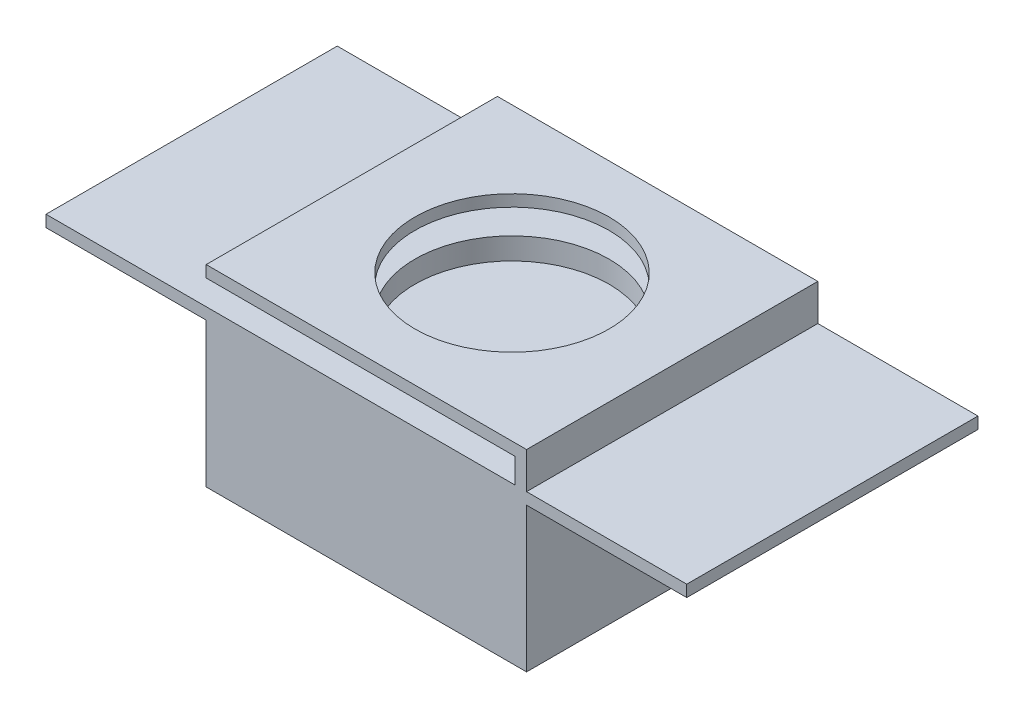
ISO-10303-21;
HEADER;
FILE_DESCRIPTION(('STEP AP214'),'2;1');
FILE_NAME('part.step','',(''),(''),'','','');
FILE_SCHEMA(('AUTOMOTIVE_DESIGN { 1 0 10303 214 1 1 1 1 }'));
ENDSEC;
DATA;
#1=APPLICATION_CONTEXT('core data for automotive mechanical design processes');
#2=APPLICATION_PROTOCOL_DEFINITION('international standard','automotive_design',2000,#1);
#3=PRODUCT_CONTEXT('',#1,'mechanical');
#4=PRODUCT('Part','Part','',(#3));
#5=PRODUCT_RELATED_PRODUCT_CATEGORY('part','',(#4));
#6=PRODUCT_DEFINITION_FORMATION('','',#4);
#7=PRODUCT_DEFINITION_CONTEXT('part definition',#1,'design');
#8=PRODUCT_DEFINITION('design','',#6,#7);
#9=PRODUCT_DEFINITION_SHAPE('','',#8);
#10=(LENGTH_UNIT() NAMED_UNIT(*) SI_UNIT(.MILLI.,.METRE.));
#11=(NAMED_UNIT(*) PLANE_ANGLE_UNIT() SI_UNIT($,.RADIAN.));
#12=(NAMED_UNIT(*) SI_UNIT($,.STERADIAN.) SOLID_ANGLE_UNIT());
#13=UNCERTAINTY_MEASURE_WITH_UNIT(LENGTH_MEASURE(1.E-05),#10,'distance_accuracy_value','');
#14=(GEOMETRIC_REPRESENTATION_CONTEXT(3) GLOBAL_UNCERTAINTY_ASSIGNED_CONTEXT((#13)) GLOBAL_UNIT_ASSIGNED_CONTEXT((#10,
#11,#12)) REPRESENTATION_CONTEXT('',''));
#15=CARTESIAN_POINT('',(0.,0.,0.));
#16=DIRECTION('',(0.,0.,1.));
#17=DIRECTION('',(1.,0.,0.));
#18=AXIS2_PLACEMENT_3D('',#15,#16,#17);
#19=CARTESIAN_POINT('',(-17.4625,15.748,31.75));
#20=DIRECTION('',(1.,0.,0.));
#21=DIRECTION('',(0.,0.,-1.));
#22=AXIS2_PLACEMENT_3D('',#19,#20,#21);
#23=PLANE('',#22);
#24=DIRECTION('',(0.,-1.,0.));
#25=VECTOR('',#24,1.);
#26=CARTESIAN_POINT('',(-17.4625,15.748,0.));
#27=LINE('',#26,#25);
#28=CARTESIAN_POINT('',(-17.4625,15.748,0.));
#29=VERTEX_POINT('',#28);
#30=CARTESIAN_POINT('',(-17.4625,0.,0.));
#31=VERTEX_POINT('',#30);
#32=EDGE_CURVE('E165',#29,#31,#27,.T.);
#33=ORIENTED_EDGE('',*,*,#32,.T.);
#34=DIRECTION('',(0.,0.,-1.));
#35=VECTOR('',#34,1.);
#36=CARTESIAN_POINT('',(-17.4625,0.,31.75));
#37=LINE('',#36,#35);
#38=CARTESIAN_POINT('',(-17.4625,0.,31.75));
#39=VERTEX_POINT('',#38);
#40=EDGE_CURVE('E11',#39,#31,#37,.T.);
#41=ORIENTED_EDGE('',*,*,#40,.F.);
#42=DIRECTION('',(0.,-1.,0.));
#43=VECTOR('',#42,1.);
#44=CARTESIAN_POINT('',(-17.4625,15.748,31.75));
#45=LINE('',#44,#43);
#46=CARTESIAN_POINT('',(-17.4625,15.748,31.75));
#47=VERTEX_POINT('',#46);
#48=EDGE_CURVE('E193',#47,#39,#45,.T.);
#49=ORIENTED_EDGE('',*,*,#48,.F.);
#50=DIRECTION('',(0.,0.,-1.));
#51=VECTOR('',#50,1.);
#52=CARTESIAN_POINT('',(-17.4625,15.748,31.75));
#53=LINE('',#52,#51);
#54=EDGE_CURVE('E161',#47,#29,#53,.T.);
#55=ORIENTED_EDGE('',*,*,#54,.T.);
#56=EDGE_LOOP('',(#33,#41,#49,#55));
#57=FACE_BOUND('',#56,.T.);
#58=ADVANCED_FACE('F33',(#57),#23,.F.);
#59=CARTESIAN_POINT('',(-17.4625,0.,31.75));
#60=DIRECTION('',(0.,1.,0.));
#61=DIRECTION('',(0.,0.,1.));
#62=AXIS2_PLACEMENT_3D('',#59,#60,#61);
#63=PLANE('',#62);
#64=DIRECTION('',(1.,0.,0.));
#65=VECTOR('',#64,1.);
#66=CARTESIAN_POINT('',(-17.4625,0.,0.));
#67=LINE('',#66,#65);
#68=CARTESIAN_POINT('',(17.4625,0.,0.));
#69=VERTEX_POINT('',#68);
#70=EDGE_CURVE('E168',#31,#69,#67,.T.);
#71=ORIENTED_EDGE('',*,*,#70,.T.);
#72=DIRECTION('',(0.,0.,-1.));
#73=VECTOR('',#72,1.);
#74=CARTESIAN_POINT('',(17.4625,0.,31.75));
#75=LINE('',#74,#73);
#76=CARTESIAN_POINT('',(17.4625,0.,31.75));
#77=VERTEX_POINT('',#76);
#78=EDGE_CURVE('E42',#77,#69,#75,.T.);
#79=ORIENTED_EDGE('',*,*,#78,.F.);
#80=DIRECTION('',(1.,0.,0.));
#81=VECTOR('',#80,1.);
#82=CARTESIAN_POINT('',(-17.4625,0.,31.75));
#83=LINE('',#82,#81);
#84=EDGE_CURVE('E111',#39,#77,#83,.T.);
#85=ORIENTED_EDGE('',*,*,#84,.F.);
#86=ORIENTED_EDGE('',*,*,#40,.T.);
#87=EDGE_LOOP('',(#71,#79,#85,#86));
#88=FACE_BOUND('',#87,.T.);
#89=ADVANCED_FACE('F283',(#88),#63,.F.);
#90=CARTESIAN_POINT('',(17.4625,0.,31.75));
#91=DIRECTION('',(-1.,0.,0.));
#92=DIRECTION('',(0.,0.,1.));
#93=AXIS2_PLACEMENT_3D('',#90,#91,#92);
#94=PLANE('',#93);
#95=DIRECTION('',(0.,1.,0.));
#96=VECTOR('',#95,1.);
#97=CARTESIAN_POINT('',(17.4625,0.,0.));
#98=LINE('',#97,#96);
#99=CARTESIAN_POINT('',(17.4625,15.748,0.));
#100=VERTEX_POINT('',#99);
#101=EDGE_CURVE('E171',#69,#100,#98,.T.);
#102=ORIENTED_EDGE('',*,*,#101,.T.);
#103=DIRECTION('',(0.,0.,-1.));
#104=VECTOR('',#103,1.);
#105=CARTESIAN_POINT('',(17.4625,15.748,31.75));
#106=LINE('',#105,#104);
#107=CARTESIAN_POINT('',(17.4625,15.748,31.75));
#108=VERTEX_POINT('',#107);
#109=EDGE_CURVE('E218',#108,#100,#106,.T.);
#110=ORIENTED_EDGE('',*,*,#109,.F.);
#111=DIRECTION('',(0.,1.,0.));
#112=VECTOR('',#111,1.);
#113=CARTESIAN_POINT('',(17.4625,0.,31.75));
#114=LINE('',#113,#112);
#115=EDGE_CURVE('E227',#77,#108,#114,.T.);
#116=ORIENTED_EDGE('',*,*,#115,.F.);
#117=ORIENTED_EDGE('',*,*,#78,.T.);
#118=EDGE_LOOP('',(#102,#110,#116,#117));
#119=FACE_BOUND('',#118,.T.);
#120=ADVANCED_FACE('F225',(#119),#94,.F.);
#121=CARTESIAN_POINT('',(17.4625,15.748,31.75));
#122=DIRECTION('',(0.,1.,0.));
#123=DIRECTION('',(-1.,0.,0.));
#124=AXIS2_PLACEMENT_3D('',#121,#122,#123);
#125=PLANE('',#124);
#126=DIRECTION('',(1.,0.,0.));
#127=VECTOR('',#126,1.);
#128=CARTESIAN_POINT('',(17.4625,15.748,0.));
#129=LINE('',#128,#127);
#130=CARTESIAN_POINT('',(34.925,15.748,0.));
#131=VERTEX_POINT('',#130);
#132=EDGE_CURVE('E173',#100,#131,#129,.T.);
#133=ORIENTED_EDGE('',*,*,#132,.T.);
#134=DIRECTION('',(0.,0.,-1.));
#135=VECTOR('',#134,1.);
#136=CARTESIAN_POINT('',(34.925,15.748,31.75));
#137=LINE('',#136,#135);
#138=CARTESIAN_POINT('',(34.925,15.748,31.75));
#139=VERTEX_POINT('',#138);
#140=EDGE_CURVE('E215',#139,#131,#137,.T.);
#141=ORIENTED_EDGE('',*,*,#140,.F.);
#142=DIRECTION('',(1.,0.,0.));
#143=VECTOR('',#142,1.);
#144=CARTESIAN_POINT('',(17.4625,15.748,31.75));
#145=LINE('',#144,#143);
#146=EDGE_CURVE('E245',#108,#139,#145,.T.);
#147=ORIENTED_EDGE('',*,*,#146,.F.);
#148=ORIENTED_EDGE('',*,*,#109,.T.);
#149=EDGE_LOOP('',(#133,#141,#147,#148));
#150=FACE_BOUND('',#149,.T.);
#151=ADVANCED_FACE('F236',(#150),#125,.F.);
#152=CARTESIAN_POINT('',(34.925,15.748,31.75));
#153=DIRECTION('',(-1.,0.,0.));
#154=DIRECTION('',(0.,0.,1.));
#155=AXIS2_PLACEMENT_3D('',#152,#153,#154);
#156=PLANE('',#155);
#157=DIRECTION('',(0.,1.,0.));
#158=VECTOR('',#157,1.);
#159=CARTESIAN_POINT('',(34.925,15.748,0.));
#160=LINE('',#159,#158);
#161=CARTESIAN_POINT('',(34.925,17.018,0.));
#162=VERTEX_POINT('',#161);
#163=EDGE_CURVE('E175',#131,#162,#160,.T.);
#164=ORIENTED_EDGE('',*,*,#163,.T.);
#165=DIRECTION('',(0.,0.,-1.));
#166=VECTOR('',#165,1.);
#167=CARTESIAN_POINT('',(34.925,17.018,31.75));
#168=LINE('',#167,#166);
#169=CARTESIAN_POINT('',(34.925,17.018,31.75));
#170=VERTEX_POINT('',#169);
#171=EDGE_CURVE('E212',#170,#162,#168,.T.);
#172=ORIENTED_EDGE('',*,*,#171,.F.);
#173=DIRECTION('',(0.,1.,0.));
#174=VECTOR('',#173,1.);
#175=CARTESIAN_POINT('',(34.925,15.748,31.75));
#176=LINE('',#175,#174);
#177=EDGE_CURVE('E242',#139,#170,#176,.T.);
#178=ORIENTED_EDGE('',*,*,#177,.F.);
#179=ORIENTED_EDGE('',*,*,#140,.T.);
#180=EDGE_LOOP('',(#164,#172,#178,#179));
#181=FACE_BOUND('',#180,.T.);
#182=ADVANCED_FACE('F240',(#181),#156,.F.);
#183=CARTESIAN_POINT('',(17.4625,17.018,31.75));
#184=DIRECTION('',(0.,-1.,0.));
#185=DIRECTION('',(0.,0.,-1.));
#186=AXIS2_PLACEMENT_3D('',#183,#184,#185);
#187=PLANE('',#186);
#188=DIRECTION('',(-1.,0.,0.));
#189=VECTOR('',#188,1.);
#190=CARTESIAN_POINT('',(17.4625,17.018,0.));
#191=LINE('',#190,#189);
#192=CARTESIAN_POINT('',(17.4625,17.018,0.));
#193=VERTEX_POINT('',#192);
#194=EDGE_CURVE('E177',#162,#193,#191,.T.);
#195=ORIENTED_EDGE('',*,*,#194,.T.);
#196=DIRECTION('',(0.,0.,-1.));
#197=VECTOR('',#196,1.);
#198=CARTESIAN_POINT('',(17.4625,17.018,31.75));
#199=LINE('',#198,#197);
#200=CARTESIAN_POINT('',(17.4625,17.018,31.75));
#201=VERTEX_POINT('',#200);
#202=EDGE_CURVE('E209',#201,#193,#199,.T.);
#203=ORIENTED_EDGE('',*,*,#202,.F.);
#204=DIRECTION('',(-1.,0.,0.));
#205=VECTOR('',#204,1.);
#206=CARTESIAN_POINT('',(17.4625,17.018,31.75));
#207=LINE('',#206,#205);
#208=EDGE_CURVE('E244',#170,#201,#207,.T.);
#209=ORIENTED_EDGE('',*,*,#208,.F.);
#210=ORIENTED_EDGE('',*,*,#171,.T.);
#211=EDGE_LOOP('',(#195,#203,#209,#210));
#212=FACE_BOUND('',#211,.T.);
#213=ADVANCED_FACE('F296',(#212),#187,.F.);
#214=CARTESIAN_POINT('',(17.4625,20.9973333333333,31.75));
#215=DIRECTION('',(-1.,0.,0.));
#216=DIRECTION('',(0.,0.,1.));
#217=AXIS2_PLACEMENT_3D('',#214,#215,#216);
#218=PLANE('',#217);
#219=DIRECTION('',(0.,1.,0.));
#220=VECTOR('',#219,1.);
#221=CARTESIAN_POINT('',(17.4625,20.9973333333333,0.));
#222=LINE('',#221,#220);
#223=CARTESIAN_POINT('',(17.4625,20.9973333333333,0.));
#224=VERTEX_POINT('',#223);
#225=EDGE_CURVE('E179',#193,#224,#222,.T.);
#226=ORIENTED_EDGE('',*,*,#225,.T.);
#227=DIRECTION('',(0.,0.,-1.));
#228=VECTOR('',#227,1.);
#229=CARTESIAN_POINT('',(17.4625,20.9973333333333,31.75));
#230=LINE('',#229,#228);
#231=CARTESIAN_POINT('',(17.4625,20.9973333333333,31.75));
#232=VERTEX_POINT('',#231);
#233=EDGE_CURVE('E206',#232,#224,#230,.T.);
#234=ORIENTED_EDGE('',*,*,#233,.F.);
#235=DIRECTION('',(0.,1.,0.));
#236=VECTOR('',#235,1.);
#237=CARTESIAN_POINT('',(17.4625,20.9973333333333,31.75));
#238=LINE('',#237,#236);
#239=EDGE_CURVE('E247',#201,#232,#238,.T.);
#240=ORIENTED_EDGE('',*,*,#239,.F.);
#241=ORIENTED_EDGE('',*,*,#202,.T.);
#242=EDGE_LOOP('',(#226,#234,#240,#241));
#243=FACE_BOUND('',#242,.T.);
#244=ADVANCED_FACE('F299',(#243),#218,.F.);
#245=CARTESIAN_POINT('',(17.4625,20.9973333333333,31.75));
#246=DIRECTION('',(0.,-1.,0.));
#247=DIRECTION('',(0.,0.,-1.));
#248=AXIS2_PLACEMENT_3D('',#245,#246,#247);
#249=PLANE('',#248);
#250=CARTESIAN_POINT('',(0.,20.9973333333333,15.875));
#251=DIRECTION('',(0.,1.,0.));
#252=DIRECTION('',(0.,0.,1.));
#253=AXIS2_PLACEMENT_3D('',#250,#251,#252);
#254=CIRCLE('',#253,10.5833333333333);
#255=CARTESIAN_POINT('',(0.,20.9973333333333,26.4583333333333));
#256=VERTEX_POINT('',#255);
#257=EDGE_CURVE('E328',#256,#256,#254,.T.);
#258=ORIENTED_EDGE('',*,*,#257,.F.);
#259=EDGE_LOOP('',(#258));
#260=FACE_BOUND('',#259,.T.);
#261=DIRECTION('',(-1.,0.,0.));
#262=VECTOR('',#261,1.);
#263=CARTESIAN_POINT('',(17.4625,20.9973333333333,0.));
#264=LINE('',#263,#262);
#265=CARTESIAN_POINT('',(-17.4625,20.9973333333333,0.));
#266=VERTEX_POINT('',#265);
#267=EDGE_CURVE('E181',#224,#266,#264,.T.);
#268=ORIENTED_EDGE('',*,*,#267,.T.);
#269=DIRECTION('',(0.,0.,-1.));
#270=VECTOR('',#269,1.);
#271=CARTESIAN_POINT('',(-17.4625,20.9973333333333,31.75));
#272=LINE('',#271,#270);
#273=CARTESIAN_POINT('',(-17.4625,20.9973333333333,31.75));
#274=VERTEX_POINT('',#273);
#275=EDGE_CURVE('E203',#274,#266,#272,.T.);
#276=ORIENTED_EDGE('',*,*,#275,.F.);
#277=DIRECTION('',(-1.,0.,0.));
#278=VECTOR('',#277,1.);
#279=CARTESIAN_POINT('',(17.4625,20.9973333333333,31.75));
#280=LINE('',#279,#278);
#281=EDGE_CURVE('E253',#232,#274,#280,.T.);
#282=ORIENTED_EDGE('',*,*,#281,.F.);
#283=ORIENTED_EDGE('',*,*,#233,.T.);
#284=EDGE_LOOP('',(#268,#276,#282,#283));
#285=FACE_BOUND('',#284,.T.);
#286=ADVANCED_FACE('F303',(#260,#285),#249,.F.);
#287=CARTESIAN_POINT('',(-17.4625,19.7273333333333,31.75));
#288=DIRECTION('',(1.,0.,0.));
#289=DIRECTION('',(0.,0.,-1.));
#290=AXIS2_PLACEMENT_3D('',#287,#288,#289);
#291=PLANE('',#290);
#292=DIRECTION('',(0.,-1.,0.));
#293=VECTOR('',#292,1.);
#294=CARTESIAN_POINT('',(-17.4625,19.7273333333333,0.));
#295=LINE('',#294,#293);
#296=CARTESIAN_POINT('',(-17.4625,19.7273333333333,0.));
#297=VERTEX_POINT('',#296);
#298=EDGE_CURVE('E183',#266,#297,#295,.T.);
#299=ORIENTED_EDGE('',*,*,#298,.T.);
#300=DIRECTION('',(0.,0.,-1.));
#301=VECTOR('',#300,1.);
#302=CARTESIAN_POINT('',(-17.4625,19.7273333333333,31.75));
#303=LINE('',#302,#301);
#304=CARTESIAN_POINT('',(-17.4625,19.7273333333333,31.75));
#305=VERTEX_POINT('',#304);
#306=EDGE_CURVE('E200',#305,#297,#303,.T.);
#307=ORIENTED_EDGE('',*,*,#306,.F.);
#308=DIRECTION('',(0.,-1.,0.));
#309=VECTOR('',#308,1.);
#310=CARTESIAN_POINT('',(-17.4625,19.7273333333333,31.75));
#311=LINE('',#310,#309);
#312=EDGE_CURVE('E255',#274,#305,#311,.T.);
#313=ORIENTED_EDGE('',*,*,#312,.F.);
#314=ORIENTED_EDGE('',*,*,#275,.T.);
#315=EDGE_LOOP('',(#299,#307,#313,#314));
#316=FACE_BOUND('',#315,.T.);
#317=ADVANCED_FACE('F307',(#316),#291,.F.);
#318=CARTESIAN_POINT('',(-17.4625,19.7273333333333,31.75));
#319=DIRECTION('',(0.,1.,0.));
#320=DIRECTION('',(0.,0.,1.));
#321=AXIS2_PLACEMENT_3D('',#318,#319,#320);
#322=PLANE('',#321);
#323=CARTESIAN_POINT('',(0.,19.7273333333333,15.875));
#324=DIRECTION('',(0.,1.,0.));
#325=DIRECTION('',(0.,0.,1.));
#326=AXIS2_PLACEMENT_3D('',#323,#324,#325);
#327=CIRCLE('',#326,10.5833333333333);
#328=CARTESIAN_POINT('',(0.,19.7273333333333,26.4583333333333));
#329=VERTEX_POINT('',#328);
#330=EDGE_CURVE('E169',#329,#329,#327,.T.);
#331=ORIENTED_EDGE('',*,*,#330,.T.);
#332=EDGE_LOOP('',(#331));
#333=FACE_BOUND('',#332,.T.);
#334=DIRECTION('',(1.,0.,0.));
#335=VECTOR('',#334,1.);
#336=CARTESIAN_POINT('',(-17.4625,19.7273333333333,0.));
#337=LINE('',#336,#335);
#338=CARTESIAN_POINT('',(16.1925,19.7273333333333,0.));
#339=VERTEX_POINT('',#338);
#340=EDGE_CURVE('E185',#297,#339,#337,.T.);
#341=ORIENTED_EDGE('',*,*,#340,.T.);
#342=DIRECTION('',(0.,0.,-1.));
#343=VECTOR('',#342,1.);
#344=CARTESIAN_POINT('',(16.1925,19.7273333333333,31.75));
#345=LINE('',#344,#343);
#346=CARTESIAN_POINT('',(16.1925,19.7273333333333,31.75));
#347=VERTEX_POINT('',#346);
#348=EDGE_CURVE('E197',#347,#339,#345,.T.);
#349=ORIENTED_EDGE('',*,*,#348,.F.);
#350=DIRECTION('',(1.,0.,0.));
#351=VECTOR('',#350,1.);
#352=CARTESIAN_POINT('',(-17.4625,19.7273333333333,31.75));
#353=LINE('',#352,#351);
#354=EDGE_CURVE('E257',#305,#347,#353,.T.);
#355=ORIENTED_EDGE('',*,*,#354,.F.);
#356=ORIENTED_EDGE('',*,*,#306,.T.);
#357=EDGE_LOOP('',(#341,#349,#355,#356));
#358=FACE_BOUND('',#357,.T.);
#359=ADVANCED_FACE('F263',(#333,#358),#322,.F.);
#360=CARTESIAN_POINT('',(16.1925,19.7273333333333,31.75));
#361=DIRECTION('',(1.,0.,0.));
#362=DIRECTION('',(0.,0.,-1.));
#363=AXIS2_PLACEMENT_3D('',#360,#361,#362);
#364=PLANE('',#363);
#365=DIRECTION('',(0.,-1.,0.));
#366=VECTOR('',#365,1.);
#367=CARTESIAN_POINT('',(16.1925,19.7273333333333,0.));
#368=LINE('',#367,#366);
#369=CARTESIAN_POINT('',(16.1925,17.018,0.));
#370=VERTEX_POINT('',#369);
#371=EDGE_CURVE('E187',#339,#370,#368,.T.);
#372=ORIENTED_EDGE('',*,*,#371,.T.);
#373=DIRECTION('',(0.,0.,-1.));
#374=VECTOR('',#373,1.);
#375=CARTESIAN_POINT('',(16.1925,17.018,31.75));
#376=LINE('',#375,#374);
#377=CARTESIAN_POINT('',(16.1925,17.018,31.75));
#378=VERTEX_POINT('',#377);
#379=EDGE_CURVE('E156',#378,#370,#376,.T.);
#380=ORIENTED_EDGE('',*,*,#379,.F.);
#381=DIRECTION('',(0.,-1.,0.));
#382=VECTOR('',#381,1.);
#383=CARTESIAN_POINT('',(16.1925,19.7273333333333,31.75));
#384=LINE('',#383,#382);
#385=EDGE_CURVE('E148',#347,#378,#384,.T.);
#386=ORIENTED_EDGE('',*,*,#385,.F.);
#387=ORIENTED_EDGE('',*,*,#348,.T.);
#388=EDGE_LOOP('',(#372,#380,#386,#387));
#389=FACE_BOUND('',#388,.T.);
#390=ADVANCED_FACE('F267',(#389),#364,.F.);
#391=CARTESIAN_POINT('',(-34.925,17.018,31.75));
#392=DIRECTION('',(0.,-1.,0.));
#393=DIRECTION('',(0.,0.,-1.));
#394=AXIS2_PLACEMENT_3D('',#391,#392,#393);
#395=PLANE('',#394);
#396=CARTESIAN_POINT('',(0.,17.018,15.875));
#397=DIRECTION('',(0.,-1.,0.));
#398=DIRECTION('',(0.,0.,-1.));
#399=AXIS2_PLACEMENT_3D('',#396,#397,#398);
#400=CIRCLE('',#399,10.5833333333333);
#401=CARTESIAN_POINT('',(0.,17.018,5.29166666666666));
#402=VERTEX_POINT('',#401);
#403=EDGE_CURVE('E36',#402,#402,#400,.T.);
#404=ORIENTED_EDGE('',*,*,#403,.T.);
#405=EDGE_LOOP('',(#404));
#406=FACE_BOUND('',#405,.T.);
#407=DIRECTION('',(-1.,0.,0.));
#408=VECTOR('',#407,1.);
#409=CARTESIAN_POINT('',(-34.925,17.018,0.));
#410=LINE('',#409,#408);
#411=CARTESIAN_POINT('',(-34.925,17.018,0.));
#412=VERTEX_POINT('',#411);
#413=EDGE_CURVE('E155',#370,#412,#410,.T.);
#414=ORIENTED_EDGE('',*,*,#413,.T.);
#415=DIRECTION('',(0.,0.,-1.));
#416=VECTOR('',#415,1.);
#417=CARTESIAN_POINT('',(-34.925,17.018,31.75));
#418=LINE('',#417,#416);
#419=CARTESIAN_POINT('',(-34.925,17.018,31.75));
#420=VERTEX_POINT('',#419);
#421=EDGE_CURVE('E153',#420,#412,#418,.T.);
#422=ORIENTED_EDGE('',*,*,#421,.F.);
#423=DIRECTION('',(-1.,0.,0.));
#424=VECTOR('',#423,1.);
#425=CARTESIAN_POINT('',(16.1925,17.018,31.75));
#426=LINE('',#425,#424);
#427=EDGE_CURVE('E142',#378,#420,#426,.T.);
#428=ORIENTED_EDGE('',*,*,#427,.F.);
#429=ORIENTED_EDGE('',*,*,#379,.T.);
#430=EDGE_LOOP('',(#414,#422,#428,#429));
#431=FACE_BOUND('',#430,.T.);
#432=ADVANCED_FACE('F154',(#406,#431),#395,.F.);
#433=CARTESIAN_POINT('',(-34.925,17.018,31.75));
#434=DIRECTION('',(1.,0.,0.));
#435=DIRECTION('',(0.,0.,-1.));
#436=AXIS2_PLACEMENT_3D('',#433,#434,#435);
#437=PLANE('',#436);
#438=DIRECTION('',(0.,-1.,0.));
#439=VECTOR('',#438,1.);
#440=CARTESIAN_POINT('',(-34.925,17.018,0.));
#441=LINE('',#440,#439);
#442=CARTESIAN_POINT('',(-34.925,15.748,0.));
#443=VERTEX_POINT('',#442);
#444=EDGE_CURVE('E97',#412,#443,#441,.T.);
#445=ORIENTED_EDGE('',*,*,#444,.T.);
#446=DIRECTION('',(0.,0.,-1.));
#447=VECTOR('',#446,1.);
#448=CARTESIAN_POINT('',(-34.925,15.748,31.75));
#449=LINE('',#448,#447);
#450=CARTESIAN_POINT('',(-34.925,15.748,31.75));
#451=VERTEX_POINT('',#450);
#452=EDGE_CURVE('E157',#451,#443,#449,.T.);
#453=ORIENTED_EDGE('',*,*,#452,.F.);
#454=DIRECTION('',(0.,-1.,0.));
#455=VECTOR('',#454,1.);
#456=CARTESIAN_POINT('',(-34.925,17.018,31.75));
#457=LINE('',#456,#455);
#458=EDGE_CURVE('E146',#420,#451,#457,.T.);
#459=ORIENTED_EDGE('',*,*,#458,.F.);
#460=ORIENTED_EDGE('',*,*,#421,.T.);
#461=EDGE_LOOP('',(#445,#453,#459,#460));
#462=FACE_BOUND('',#461,.T.);
#463=ADVANCED_FACE('F159',(#462),#437,.F.);
#464=CARTESIAN_POINT('',(-34.925,15.748,31.75));
#465=DIRECTION('',(0.,1.,0.));
#466=DIRECTION('',(-1.,0.,0.));
#467=AXIS2_PLACEMENT_3D('',#464,#465,#466);
#468=PLANE('',#467);
#469=DIRECTION('',(1.,0.,0.));
#470=VECTOR('',#469,1.);
#471=CARTESIAN_POINT('',(-34.925,15.748,0.));
#472=LINE('',#471,#470);
#473=EDGE_CURVE('E103',#443,#29,#472,.T.);
#474=ORIENTED_EDGE('',*,*,#473,.T.);
#475=ORIENTED_EDGE('',*,*,#54,.F.);
#476=DIRECTION('',(1.,0.,0.));
#477=VECTOR('',#476,1.);
#478=CARTESIAN_POINT('',(-34.925,15.748,31.75));
#479=LINE('',#478,#477);
#480=EDGE_CURVE('E50',#451,#47,#479,.T.);
#481=ORIENTED_EDGE('',*,*,#480,.F.);
#482=ORIENTED_EDGE('',*,*,#452,.T.);
#483=EDGE_LOOP('',(#474,#475,#481,#482));
#484=FACE_BOUND('',#483,.T.);
#485=ADVANCED_FACE('F272',(#484),#468,.F.);
#486=CARTESIAN_POINT('',(0.,0.,31.75));
#487=DIRECTION('',(0.,0.,1.));
#488=DIRECTION('',(1.,0.,0.));
#489=AXIS2_PLACEMENT_3D('',#486,#487,#488);
#490=PLANE('',#489);
#491=ORIENTED_EDGE('',*,*,#48,.T.);
#492=ORIENTED_EDGE('',*,*,#84,.T.);
#493=ORIENTED_EDGE('',*,*,#115,.T.);
#494=ORIENTED_EDGE('',*,*,#146,.T.);
#495=ORIENTED_EDGE('',*,*,#177,.T.);
#496=ORIENTED_EDGE('',*,*,#208,.T.);
#497=ORIENTED_EDGE('',*,*,#239,.T.);
#498=ORIENTED_EDGE('',*,*,#281,.T.);
#499=ORIENTED_EDGE('',*,*,#312,.T.);
#500=ORIENTED_EDGE('',*,*,#354,.T.);
#501=ORIENTED_EDGE('',*,*,#385,.T.);
#502=ORIENTED_EDGE('',*,*,#427,.T.);
#503=ORIENTED_EDGE('',*,*,#458,.T.);
#504=ORIENTED_EDGE('',*,*,#480,.T.);
#505=EDGE_LOOP('',(#491,#492,#493,#494,#495,#496,#497,#498,#499,#500,#501,#502,#503,#504));
#506=FACE_BOUND('',#505,.T.);
#507=ADVANCED_FACE('F144',(#506),#490,.T.);
#508=CARTESIAN_POINT('',(0.,0.,0.));
#509=DIRECTION('',(0.,0.,1.));
#510=DIRECTION('',(1.,0.,0.));
#511=AXIS2_PLACEMENT_3D('',#508,#509,#510);
#512=PLANE('',#511);
#513=ORIENTED_EDGE('',*,*,#32,.F.);
#514=ORIENTED_EDGE('',*,*,#473,.F.);
#515=ORIENTED_EDGE('',*,*,#444,.F.);
#516=ORIENTED_EDGE('',*,*,#413,.F.);
#517=ORIENTED_EDGE('',*,*,#371,.F.);
#518=ORIENTED_EDGE('',*,*,#340,.F.);
#519=ORIENTED_EDGE('',*,*,#298,.F.);
#520=ORIENTED_EDGE('',*,*,#267,.F.);
#521=ORIENTED_EDGE('',*,*,#225,.F.);
#522=ORIENTED_EDGE('',*,*,#194,.F.);
#523=ORIENTED_EDGE('',*,*,#163,.F.);
#524=ORIENTED_EDGE('',*,*,#132,.F.);
#525=ORIENTED_EDGE('',*,*,#101,.F.);
#526=ORIENTED_EDGE('',*,*,#70,.F.);
#527=EDGE_LOOP('',(#513,#514,#515,#516,#517,#518,#519,#520,#521,#522,#523,#524,#525,#526));
#528=FACE_BOUND('',#527,.T.);
#529=ADVANCED_FACE('F231',(#528),#512,.F.);
#530=CARTESIAN_POINT('',(0.,14.6473333333333,15.875));
#531=DIRECTION('',(0.,1.,0.));
#532=DIRECTION('',(0.,0.,1.));
#533=AXIS2_PLACEMENT_3D('',#530,#531,#532);
#534=PLANE('',#533);
#535=CARTESIAN_POINT('',(0.,14.6473333333333,15.875));
#536=DIRECTION('',(0.,1.,0.));
#537=DIRECTION('',(0.,0.,1.));
#538=AXIS2_PLACEMENT_3D('',#535,#536,#537);
#539=CIRCLE('',#538,10.5833333333333);
#540=CARTESIAN_POINT('',(0.,14.6473333333333,26.4583333333333));
#541=VERTEX_POINT('',#540);
#542=EDGE_CURVE('E324',#541,#541,#539,.T.);
#543=ORIENTED_EDGE('',*,*,#542,.T.);
#544=EDGE_LOOP('',(#543));
#545=FACE_BOUND('',#544,.T.);
#546=ADVANCED_FACE('F355',(#545),#534,.T.);
#547=CARTESIAN_POINT('',(0.,14.6473333333333,15.875));
#548=DIRECTION('',(0.,1.,0.));
#549=DIRECTION('',(0.,0.,1.));
#550=AXIS2_PLACEMENT_3D('',#547,#548,#549);
#551=CYLINDRICAL_SURFACE('',#550,10.5833333333333);
#552=ORIENTED_EDGE('',*,*,#542,.F.);
#553=EDGE_LOOP('',(#552));
#554=FACE_BOUND('',#553,.T.);
#555=ORIENTED_EDGE('',*,*,#403,.F.);
#556=EDGE_LOOP('',(#555));
#557=FACE_BOUND('',#556,.T.);
#558=ADVANCED_FACE('F349',(#554,#557),#551,.F.);
#559=ORIENTED_EDGE('',*,*,#257,.T.);
#560=EDGE_LOOP('',(#559));
#561=FACE_BOUND('',#560,.T.);
#562=ORIENTED_EDGE('',*,*,#330,.F.);
#563=EDGE_LOOP('',(#562));
#564=FACE_BOUND('',#563,.T.);
#565=ADVANCED_FACE('F338',(#561,#564),#551,.F.);
#566=CLOSED_SHELL('',(#58,#89,#120,#151,#182,#213,#244,#286,#317,#359,#390,#432,#463,#485,#507,
#529,#546,#558,#565));
#567=MANIFOLD_SOLID_BREP('B2',#566);
#568=ADVANCED_BREP_SHAPE_REPRESENTATION('',(#18,#567),#14);
#569=SHAPE_DEFINITION_REPRESENTATION(#9,#568);
ENDSEC;
END-ISO-10303-21;
